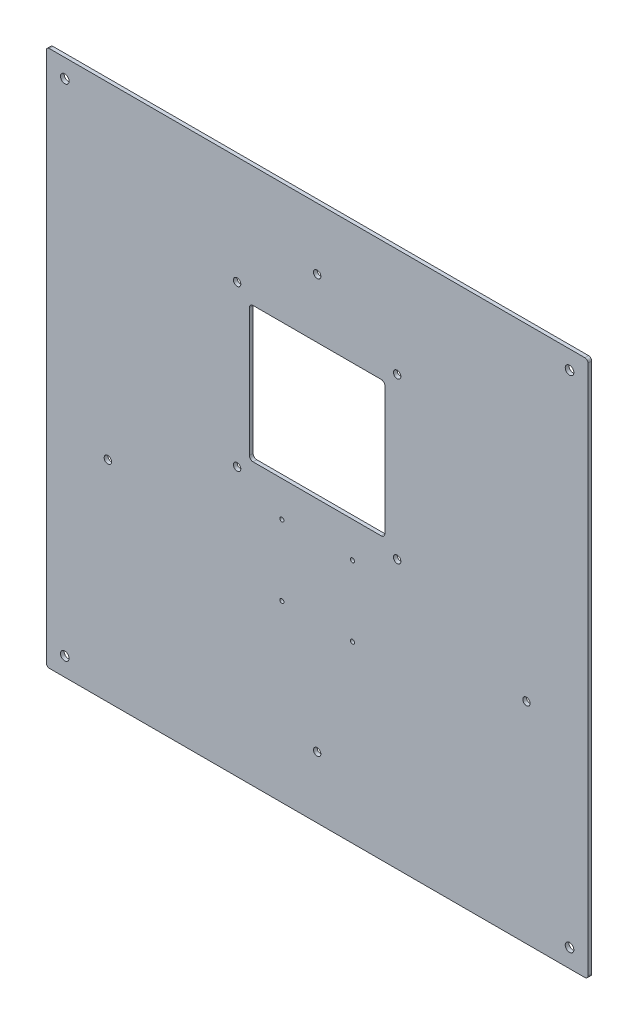
ISO-10303-21;
HEADER;
FILE_DESCRIPTION(('STEP AP214'),'2;1');
FILE_NAME('part.step','',(''),(''),'','','');
FILE_SCHEMA(('AUTOMOTIVE_DESIGN { 1 0 10303 214 1 1 1 1 }'));
ENDSEC;
DATA;
#1=APPLICATION_CONTEXT('core data for automotive mechanical design processes');
#2=APPLICATION_PROTOCOL_DEFINITION('international standard','automotive_design',2000,#1);
#3=PRODUCT_CONTEXT('',#1,'mechanical');
#4=PRODUCT('Part','Part','',(#3));
#5=PRODUCT_RELATED_PRODUCT_CATEGORY('part','',(#4));
#6=PRODUCT_DEFINITION_FORMATION('','',#4);
#7=PRODUCT_DEFINITION_CONTEXT('part definition',#1,'design');
#8=PRODUCT_DEFINITION('design','',#6,#7);
#9=PRODUCT_DEFINITION_SHAPE('','',#8);
#10=(LENGTH_UNIT() NAMED_UNIT(*) SI_UNIT(.MILLI.,.METRE.));
#11=(NAMED_UNIT(*) PLANE_ANGLE_UNIT() SI_UNIT($,.RADIAN.));
#12=(NAMED_UNIT(*) SI_UNIT($,.STERADIAN.) SOLID_ANGLE_UNIT());
#13=UNCERTAINTY_MEASURE_WITH_UNIT(LENGTH_MEASURE(1.E-05),#10,'distance_accuracy_value','');
#14=(GEOMETRIC_REPRESENTATION_CONTEXT(3) GLOBAL_UNCERTAINTY_ASSIGNED_CONTEXT((#13)) GLOBAL_UNIT_ASSIGNED_CONTEXT((#10,
#11,#12)) REPRESENTATION_CONTEXT('',''));
#15=CARTESIAN_POINT('',(0.,0.,0.));
#16=DIRECTION('',(0.,0.,1.));
#17=DIRECTION('',(1.,0.,0.));
#18=AXIS2_PLACEMENT_3D('',#15,#16,#17);
#19=CARTESIAN_POINT('',(0.,0.,3.));
#20=DIRECTION('',(0.,0.,1.));
#21=DIRECTION('',(1.,0.,0.));
#22=AXIS2_PLACEMENT_3D('',#19,#20,#21);
#23=PLANE('',#22);
#24=CARTESIAN_POINT('',(170.,-47.5,3.));
#25=DIRECTION('',(0.,0.,-1.));
#26=DIRECTION('',(-1.,0.,0.));
#27=AXIS2_PLACEMENT_3D('',#24,#25,#26);
#28=CIRCLE('',#27,3.);
#29=CARTESIAN_POINT('',(173.,-47.5,3.));
#30=VERTEX_POINT('',#29);
#31=EDGE_CURVE('E218',#30,#30,#28,.T.);
#32=ORIENTED_EDGE('',*,*,#31,.T.);
#33=EDGE_LOOP('',(#32));
#34=FACE_BOUND('',#33,.T.);
#35=CARTESIAN_POINT('',(0.,168.,3.));
#36=DIRECTION('',(0.,0.,-1.));
#37=DIRECTION('',(-1.,0.,0.));
#38=AXIS2_PLACEMENT_3D('',#35,#36,#37);
#39=CIRCLE('',#38,3.);
#40=CARTESIAN_POINT('',(3.,168.,3.));
#41=VERTEX_POINT('',#40);
#42=EDGE_CURVE('E311',#41,#41,#39,.T.);
#43=ORIENTED_EDGE('',*,*,#42,.T.);
#44=EDGE_LOOP('',(#43));
#45=FACE_BOUND('',#44,.T.);
#46=CARTESIAN_POINT('',(0.,-168.,3.));
#47=DIRECTION('',(0.,0.,-1.));
#48=DIRECTION('',(-1.,0.,0.));
#49=AXIS2_PLACEMENT_3D('',#46,#47,#48);
#50=CIRCLE('',#49,3.);
#51=CARTESIAN_POINT('',(3.,-168.,3.));
#52=VERTEX_POINT('',#51);
#53=EDGE_CURVE('E293',#52,#52,#50,.T.);
#54=ORIENTED_EDGE('',*,*,#53,.T.);
#55=EDGE_LOOP('',(#54));
#56=FACE_BOUND('',#55,.T.);
#57=CARTESIAN_POINT('',(-170.,-47.5,3.));
#58=DIRECTION('',(0.,0.,-1.));
#59=DIRECTION('',(-1.,0.,0.));
#60=AXIS2_PLACEMENT_3D('',#57,#58,#59);
#61=CIRCLE('',#60,3.);
#62=CARTESIAN_POINT('',(-167.,-47.5,3.));
#63=VERTEX_POINT('',#62);
#64=EDGE_CURVE('E353',#63,#63,#61,.T.);
#65=ORIENTED_EDGE('',*,*,#64,.T.);
#66=EDGE_LOOP('',(#65));
#67=FACE_BOUND('',#66,.T.);
#68=CARTESIAN_POINT('',(-28.638,-18.862,3.));
#69=DIRECTION('',(0.,0.,-1.));
#70=DIRECTION('',(1.,0.,0.));
#71=AXIS2_PLACEMENT_3D('',#68,#69,#70);
#72=CIRCLE('',#71,1.666);
#73=CARTESIAN_POINT('',(-30.304,-18.862,3.));
#74=VERTEX_POINT('',#73);
#75=EDGE_CURVE('E468',#74,#74,#72,.T.);
#76=ORIENTED_EDGE('',*,*,#75,.T.);
#77=EDGE_LOOP('',(#76));
#78=FACE_BOUND('',#77,.T.);
#79=CARTESIAN_POINT('',(28.638,-76.138,3.));
#80=DIRECTION('',(0.,0.,-1.));
#81=DIRECTION('',(1.,0.,0.));
#82=AXIS2_PLACEMENT_3D('',#79,#80,#81);
#83=CIRCLE('',#82,1.666);
#84=CARTESIAN_POINT('',(26.972,-76.138,3.));
#85=VERTEX_POINT('',#84);
#86=EDGE_CURVE('E285',#85,#85,#83,.T.);
#87=ORIENTED_EDGE('',*,*,#86,.T.);
#88=EDGE_LOOP('',(#87));
#89=FACE_BOUND('',#88,.T.);
#90=CARTESIAN_POINT('',(-28.638,-76.138,3.));
#91=DIRECTION('',(0.,0.,-1.));
#92=DIRECTION('',(1.,0.,0.));
#93=AXIS2_PLACEMENT_3D('',#90,#91,#92);
#94=CIRCLE('',#93,1.666);
#95=CARTESIAN_POINT('',(-30.304,-76.138,3.));
#96=VERTEX_POINT('',#95);
#97=EDGE_CURVE('E263',#96,#96,#94,.T.);
#98=ORIENTED_EDGE('',*,*,#97,.T.);
#99=EDGE_LOOP('',(#98));
#100=FACE_BOUND('',#99,.T.);
#101=CARTESIAN_POINT('',(28.638,-18.862,3.));
#102=DIRECTION('',(0.,0.,-1.));
#103=DIRECTION('',(1.,0.,0.));
#104=AXIS2_PLACEMENT_3D('',#101,#102,#103);
#105=CIRCLE('',#104,1.666);
#106=CARTESIAN_POINT('',(26.972,-18.862,3.));
#107=VERTEX_POINT('',#106);
#108=EDGE_CURVE('E494',#107,#107,#105,.T.);
#109=ORIENTED_EDGE('',*,*,#108,.T.);
#110=EDGE_LOOP('',(#109));
#111=FACE_BOUND('',#110,.T.);
#112=CARTESIAN_POINT('',(-205.,-203.,3.));
#113=DIRECTION('',(0.,0.,-1.));
#114=DIRECTION('',(-1.,0.,0.));
#115=AXIS2_PLACEMENT_3D('',#112,#113,#114);
#116=CIRCLE('',#115,3.5);
#117=CARTESIAN_POINT('',(-201.5,-203.,3.));
#118=VERTEX_POINT('',#117);
#119=EDGE_CURVE('E403',#118,#118,#116,.T.);
#120=ORIENTED_EDGE('',*,*,#119,.T.);
#121=EDGE_LOOP('',(#120));
#122=FACE_BOUND('',#121,.T.);
#123=CARTESIAN_POINT('',(-205.,203.,3.));
#124=DIRECTION('',(0.,0.,-1.));
#125=DIRECTION('',(-1.,0.,0.));
#126=AXIS2_PLACEMENT_3D('',#123,#124,#125);
#127=CIRCLE('',#126,3.5);
#128=CARTESIAN_POINT('',(-201.5,203.,3.));
#129=VERTEX_POINT('',#128);
#130=EDGE_CURVE('E299',#129,#129,#127,.T.);
#131=ORIENTED_EDGE('',*,*,#130,.T.);
#132=EDGE_LOOP('',(#131));
#133=FACE_BOUND('',#132,.T.);
#134=CARTESIAN_POINT('',(205.,-203.,3.));
#135=DIRECTION('',(0.,0.,-1.));
#136=DIRECTION('',(-1.,0.,0.));
#137=AXIS2_PLACEMENT_3D('',#134,#135,#136);
#138=CIRCLE('',#137,3.5);
#139=CARTESIAN_POINT('',(208.5,-203.,3.));
#140=VERTEX_POINT('',#139);
#141=EDGE_CURVE('E401',#140,#140,#138,.T.);
#142=ORIENTED_EDGE('',*,*,#141,.T.);
#143=EDGE_LOOP('',(#142));
#144=FACE_BOUND('',#143,.T.);
#145=CARTESIAN_POINT('',(205.,203.,3.));
#146=DIRECTION('',(0.,0.,-1.));
#147=DIRECTION('',(-1.,0.,0.));
#148=AXIS2_PLACEMENT_3D('',#145,#146,#147);
#149=CIRCLE('',#148,3.5);
#150=CARTESIAN_POINT('',(208.5,203.,3.));
#151=VERTEX_POINT('',#150);
#152=EDGE_CURVE('E402',#151,#151,#149,.T.);
#153=ORIENTED_EDGE('',*,*,#152,.T.);
#154=EDGE_LOOP('',(#153));
#155=FACE_BOUND('',#154,.T.);
#156=DIRECTION('',(0.,1.,0.));
#157=VECTOR('',#156,1.);
#158=CARTESIAN_POINT('',(-55.,6.5,3.));
#159=LINE('',#158,#157);
#160=CARTESIAN_POINT('',(-55.,13.,3.));
#161=VERTEX_POINT('',#160);
#162=CARTESIAN_POINT('',(-55.,117.,3.));
#163=VERTEX_POINT('',#162);
#164=EDGE_CURVE('E397',#161,#163,#159,.T.);
#165=ORIENTED_EDGE('',*,*,#164,.T.);
#166=CARTESIAN_POINT('',(-52.,117.,3.));
#167=DIRECTION('',(0.,0.,-1.));
#168=DIRECTION('',(0.,1.,0.));
#169=AXIS2_PLACEMENT_3D('',#166,#167,#168);
#170=CIRCLE('',#169,3.);
#171=CARTESIAN_POINT('',(-52.,120.,3.));
#172=VERTEX_POINT('',#171);
#173=EDGE_CURVE('E283',#163,#172,#170,.T.);
#174=ORIENTED_EDGE('',*,*,#173,.T.);
#175=DIRECTION('',(1.,0.,0.));
#176=VECTOR('',#175,1.);
#177=CARTESIAN_POINT('',(-26.,120.,3.));
#178=LINE('',#177,#176);
#179=CARTESIAN_POINT('',(52.,120.,3.));
#180=VERTEX_POINT('',#179);
#181=EDGE_CURVE('E257',#172,#180,#178,.T.);
#182=ORIENTED_EDGE('',*,*,#181,.T.);
#183=CARTESIAN_POINT('',(52.,117.,3.));
#184=DIRECTION('',(0.,0.,-1.));
#185=DIRECTION('',(1.,0.,0.));
#186=AXIS2_PLACEMENT_3D('',#183,#184,#185);
#187=CIRCLE('',#186,3.);
#188=CARTESIAN_POINT('',(55.,117.,3.));
#189=VERTEX_POINT('',#188);
#190=EDGE_CURVE('E258',#180,#189,#187,.T.);
#191=ORIENTED_EDGE('',*,*,#190,.T.);
#192=DIRECTION('',(0.,-1.,0.));
#193=VECTOR('',#192,1.);
#194=CARTESIAN_POINT('',(55.,58.5,3.));
#195=LINE('',#194,#193);
#196=CARTESIAN_POINT('',(55.,13.,3.));
#197=VERTEX_POINT('',#196);
#198=EDGE_CURVE('E241',#189,#197,#195,.T.);
#199=ORIENTED_EDGE('',*,*,#198,.T.);
#200=CARTESIAN_POINT('',(52.,13.,3.));
#201=DIRECTION('',(0.,0.,-1.));
#202=DIRECTION('',(0.,-1.,0.));
#203=AXIS2_PLACEMENT_3D('',#200,#201,#202);
#204=CIRCLE('',#203,3.);
#205=CARTESIAN_POINT('',(52.,10.,3.));
#206=VERTEX_POINT('',#205);
#207=EDGE_CURVE('E459',#197,#206,#204,.T.);
#208=ORIENTED_EDGE('',*,*,#207,.T.);
#209=DIRECTION('',(-1.,0.,0.));
#210=VECTOR('',#209,1.);
#211=CARTESIAN_POINT('',(26.,10.,3.));
#212=LINE('',#211,#210);
#213=CARTESIAN_POINT('',(-52.,10.,3.));
#214=VERTEX_POINT('',#213);
#215=EDGE_CURVE('E498',#206,#214,#212,.T.);
#216=ORIENTED_EDGE('',*,*,#215,.T.);
#217=CARTESIAN_POINT('',(-52.,13.,3.));
#218=DIRECTION('',(0.,0.,-1.));
#219=DIRECTION('',(-1.,0.,0.));
#220=AXIS2_PLACEMENT_3D('',#217,#218,#219);
#221=CIRCLE('',#220,3.);
#222=EDGE_CURVE('E396',#214,#161,#221,.T.);
#223=ORIENTED_EDGE('',*,*,#222,.T.);
#224=EDGE_LOOP('',(#165,#174,#182,#191,#199,#208,#216,#223));
#225=FACE_BOUND('',#224,.T.);
#226=CARTESIAN_POINT('',(65.,130.,3.));
#227=DIRECTION('',(0.,0.,-1.));
#228=DIRECTION('',(-1.,0.,0.));
#229=AXIS2_PLACEMENT_3D('',#226,#227,#228);
#230=CIRCLE('',#229,3.);
#231=CARTESIAN_POINT('',(68.,130.,3.));
#232=VERTEX_POINT('',#231);
#233=EDGE_CURVE('E251',#232,#232,#230,.T.);
#234=ORIENTED_EDGE('',*,*,#233,.T.);
#235=EDGE_LOOP('',(#234));
#236=FACE_BOUND('',#235,.T.);
#237=CARTESIAN_POINT('',(-65.,0.,3.));
#238=DIRECTION('',(0.,0.,-1.));
#239=DIRECTION('',(-1.,0.,0.));
#240=AXIS2_PLACEMENT_3D('',#237,#238,#239);
#241=CIRCLE('',#240,3.);
#242=CARTESIAN_POINT('',(-62.,0.,3.));
#243=VERTEX_POINT('',#242);
#244=EDGE_CURVE('E419',#243,#243,#241,.T.);
#245=ORIENTED_EDGE('',*,*,#244,.T.);
#246=EDGE_LOOP('',(#245));
#247=FACE_BOUND('',#246,.T.);
#248=CARTESIAN_POINT('',(65.,0.,3.));
#249=DIRECTION('',(0.,0.,-1.));
#250=DIRECTION('',(-1.,0.,0.));
#251=AXIS2_PLACEMENT_3D('',#248,#249,#250);
#252=CIRCLE('',#251,3.);
#253=CARTESIAN_POINT('',(68.,0.,3.));
#254=VERTEX_POINT('',#253);
#255=EDGE_CURVE('E384',#254,#254,#252,.T.);
#256=ORIENTED_EDGE('',*,*,#255,.T.);
#257=EDGE_LOOP('',(#256));
#258=FACE_BOUND('',#257,.T.);
#259=CARTESIAN_POINT('',(-65.,130.,3.));
#260=DIRECTION('',(0.,0.,-1.));
#261=DIRECTION('',(-1.,0.,0.));
#262=AXIS2_PLACEMENT_3D('',#259,#260,#261);
#263=CIRCLE('',#262,3.);
#264=CARTESIAN_POINT('',(-62.,130.,3.));
#265=VERTEX_POINT('',#264);
#266=EDGE_CURVE('E433',#265,#265,#263,.T.);
#267=ORIENTED_EDGE('',*,*,#266,.T.);
#268=EDGE_LOOP('',(#267));
#269=FACE_BOUND('',#268,.T.);
#270=CARTESIAN_POINT('',(217.5,215.5,3.));
#271=DIRECTION('',(0.,0.,-1.));
#272=DIRECTION('',(0.707106781186548,0.707106781186548,0.));
#273=AXIS2_PLACEMENT_3D('',#270,#271,#272);
#274=CIRCLE('',#273,2.5);
#275=CARTESIAN_POINT('',(217.5,218.,3.));
#276=VERTEX_POINT('',#275);
#277=CARTESIAN_POINT('',(220.,215.5,3.));
#278=VERTEX_POINT('',#277);
#279=EDGE_CURVE('E309',#276,#278,#274,.T.);
#280=ORIENTED_EDGE('',*,*,#279,.F.);
#281=DIRECTION('',(-1.,0.,0.));
#282=VECTOR('',#281,1.);
#283=CARTESIAN_POINT('',(-220.,218.,3.));
#284=LINE('',#283,#282);
#285=CARTESIAN_POINT('',(-217.5,218.,3.));
#286=VERTEX_POINT('',#285);
#287=EDGE_CURVE('E287',#276,#286,#284,.T.);
#288=ORIENTED_EDGE('',*,*,#287,.T.);
#289=CARTESIAN_POINT('',(-217.5,215.5,3.));
#290=DIRECTION('',(0.,0.,-1.));
#291=DIRECTION('',(-0.707106781186548,0.707106781186548,0.));
#292=AXIS2_PLACEMENT_3D('',#289,#290,#291);
#293=CIRCLE('',#292,2.5);
#294=CARTESIAN_POINT('',(-220.,215.5,3.));
#295=VERTEX_POINT('',#294);
#296=EDGE_CURVE('E225',#295,#286,#293,.T.);
#297=ORIENTED_EDGE('',*,*,#296,.F.);
#298=DIRECTION('',(0.,-1.,0.));
#299=VECTOR('',#298,1.);
#300=CARTESIAN_POINT('',(-220.,-218.,3.));
#301=LINE('',#300,#299);
#302=CARTESIAN_POINT('',(-220.,-215.5,3.));
#303=VERTEX_POINT('',#302);
#304=EDGE_CURVE('E246',#295,#303,#301,.T.);
#305=ORIENTED_EDGE('',*,*,#304,.T.);
#306=CARTESIAN_POINT('',(-217.5,-215.5,3.));
#307=DIRECTION('',(0.,0.,-1.));
#308=DIRECTION('',(-0.707106781186548,-0.707106781186548,0.));
#309=AXIS2_PLACEMENT_3D('',#306,#307,#308);
#310=CIRCLE('',#309,2.5);
#311=CARTESIAN_POINT('',(-217.5,-218.,3.));
#312=VERTEX_POINT('',#311);
#313=EDGE_CURVE('E357',#312,#303,#310,.T.);
#314=ORIENTED_EDGE('',*,*,#313,.F.);
#315=DIRECTION('',(1.,0.,0.));
#316=VECTOR('',#315,1.);
#317=CARTESIAN_POINT('',(220.,-218.,3.));
#318=LINE('',#317,#316);
#319=CARTESIAN_POINT('',(217.5,-218.,3.));
#320=VERTEX_POINT('',#319);
#321=EDGE_CURVE('E367',#312,#320,#318,.T.);
#322=ORIENTED_EDGE('',*,*,#321,.T.);
#323=CARTESIAN_POINT('',(217.5,-215.5,3.));
#324=DIRECTION('',(0.,0.,-1.));
#325=DIRECTION('',(0.707106781186548,-0.707106781186548,0.));
#326=AXIS2_PLACEMENT_3D('',#323,#324,#325);
#327=CIRCLE('',#326,2.5);
#328=CARTESIAN_POINT('',(220.,-215.5,3.));
#329=VERTEX_POINT('',#328);
#330=EDGE_CURVE('E338',#329,#320,#327,.T.);
#331=ORIENTED_EDGE('',*,*,#330,.F.);
#332=DIRECTION('',(0.,1.,0.));
#333=VECTOR('',#332,1.);
#334=CARTESIAN_POINT('',(220.,218.,3.));
#335=LINE('',#334,#333);
#336=EDGE_CURVE('E10',#329,#278,#335,.T.);
#337=ORIENTED_EDGE('',*,*,#336,.T.);
#338=EDGE_LOOP('',(#280,#288,#297,#305,#314,#322,#331,#337));
#339=FACE_BOUND('',#338,.T.);
#340=ADVANCED_FACE('F15',(#34,#45,#56,#67,#78,#89,#100,#111,#122,#133,#144,#155,#225,#236,#247,
#258,#269,#339),#23,.T.);
#341=CARTESIAN_POINT('',(220.,-218.,0.));
#342=DIRECTION('',(1.,0.,0.));
#343=DIRECTION('',(0.,1.,0.));
#344=AXIS2_PLACEMENT_3D('',#341,#342,#343);
#345=PLANE('',#344);
#346=DIRECTION('',(0.,0.,-1.));
#347=VECTOR('',#346,1.);
#348=CARTESIAN_POINT('',(220.,215.5,0.));
#349=LINE('',#348,#347);
#350=CARTESIAN_POINT('',(220.,215.5,0.));
#351=VERTEX_POINT('',#350);
#352=EDGE_CURVE('E305',#278,#351,#349,.T.);
#353=ORIENTED_EDGE('',*,*,#352,.F.);
#354=ORIENTED_EDGE('',*,*,#336,.F.);
#355=DIRECTION('',(0.,0.,1.));
#356=VECTOR('',#355,1.);
#357=CARTESIAN_POINT('',(220.,-215.5,0.));
#358=LINE('',#357,#356);
#359=CARTESIAN_POINT('',(220.,-215.5,0.));
#360=VERTEX_POINT('',#359);
#361=EDGE_CURVE('E333',#360,#329,#358,.T.);
#362=ORIENTED_EDGE('',*,*,#361,.F.);
#363=DIRECTION('',(0.,-1.,0.));
#364=VECTOR('',#363,1.);
#365=CARTESIAN_POINT('',(220.,218.,0.));
#366=LINE('',#365,#364);
#367=EDGE_CURVE('E291',#351,#360,#366,.T.);
#368=ORIENTED_EDGE('',*,*,#367,.F.);
#369=EDGE_LOOP('',(#353,#354,#362,#368));
#370=FACE_BOUND('',#369,.T.);
#371=ADVANCED_FACE('F591',(#370),#345,.T.);
#372=CARTESIAN_POINT('',(170.,-47.5,3.));
#373=DIRECTION('',(0.,0.,-1.));
#374=DIRECTION('',(-1.,0.,0.));
#375=AXIS2_PLACEMENT_3D('',#372,#373,#374);
#376=CYLINDRICAL_SURFACE('',#375,3.);
#377=ORIENTED_EDGE('',*,*,#31,.F.);
#378=DIRECTION('',(0.,0.,-1.));
#379=VECTOR('',#378,1.);
#380=CARTESIAN_POINT('',(173.,-47.5,3.));
#381=LINE('',#380,#379);
#382=CARTESIAN_POINT('',(173.,-47.5,0.));
#383=VERTEX_POINT('',#382);
#384=EDGE_CURVE('E26',#30,#383,#381,.T.);
#385=ORIENTED_EDGE('',*,*,#384,.T.);
#386=CARTESIAN_POINT('',(170.,-47.5,0.));
#387=DIRECTION('',(0.,0.,1.));
#388=DIRECTION('',(-1.,0.,0.));
#389=AXIS2_PLACEMENT_3D('',#386,#387,#388);
#390=CIRCLE('',#389,3.);
#391=EDGE_CURVE('E217',#383,#383,#390,.T.);
#392=ORIENTED_EDGE('',*,*,#391,.F.);
#393=ORIENTED_EDGE('',*,*,#384,.F.);
#394=EDGE_LOOP('',(#377,#385,#392,#393));
#395=FACE_BOUND('',#394,.T.);
#396=ADVANCED_FACE('F216',(#395),#376,.F.);
#397=CARTESIAN_POINT('',(0.,168.,3.));
#398=DIRECTION('',(0.,0.,-1.));
#399=DIRECTION('',(-1.,0.,0.));
#400=AXIS2_PLACEMENT_3D('',#397,#398,#399);
#401=CYLINDRICAL_SURFACE('',#400,3.);
#402=ORIENTED_EDGE('',*,*,#42,.F.);
#403=DIRECTION('',(0.,0.,-1.));
#404=VECTOR('',#403,1.);
#405=CARTESIAN_POINT('',(3.,168.,3.));
#406=LINE('',#405,#404);
#407=CARTESIAN_POINT('',(3.,168.,0.));
#408=VERTEX_POINT('',#407);
#409=EDGE_CURVE('E321',#41,#408,#406,.T.);
#410=ORIENTED_EDGE('',*,*,#409,.T.);
#411=CARTESIAN_POINT('',(0.,168.,0.));
#412=DIRECTION('',(0.,0.,1.));
#413=DIRECTION('',(-1.,0.,0.));
#414=AXIS2_PLACEMENT_3D('',#411,#412,#413);
#415=CIRCLE('',#414,3.);
#416=EDGE_CURVE('E226',#408,#408,#415,.T.);
#417=ORIENTED_EDGE('',*,*,#416,.F.);
#418=ORIENTED_EDGE('',*,*,#409,.F.);
#419=EDGE_LOOP('',(#402,#410,#417,#418));
#420=FACE_BOUND('',#419,.T.);
#421=ADVANCED_FACE('F822',(#420),#401,.F.);
#422=CARTESIAN_POINT('',(0.,-168.,3.));
#423=DIRECTION('',(0.,0.,-1.));
#424=DIRECTION('',(-1.,0.,0.));
#425=AXIS2_PLACEMENT_3D('',#422,#423,#424);
#426=CYLINDRICAL_SURFACE('',#425,3.);
#427=ORIENTED_EDGE('',*,*,#53,.F.);
#428=DIRECTION('',(0.,0.,-1.));
#429=VECTOR('',#428,1.);
#430=CARTESIAN_POINT('',(3.,-168.,3.));
#431=LINE('',#430,#429);
#432=CARTESIAN_POINT('',(3.,-168.,0.));
#433=VERTEX_POINT('',#432);
#434=EDGE_CURVE('E297',#52,#433,#431,.T.);
#435=ORIENTED_EDGE('',*,*,#434,.T.);
#436=CARTESIAN_POINT('',(0.,-168.,0.));
#437=DIRECTION('',(0.,0.,1.));
#438=DIRECTION('',(-1.,0.,0.));
#439=AXIS2_PLACEMENT_3D('',#436,#437,#438);
#440=CIRCLE('',#439,3.);
#441=EDGE_CURVE('E237',#433,#433,#440,.T.);
#442=ORIENTED_EDGE('',*,*,#441,.F.);
#443=ORIENTED_EDGE('',*,*,#434,.F.);
#444=EDGE_LOOP('',(#427,#435,#442,#443));
#445=FACE_BOUND('',#444,.T.);
#446=ADVANCED_FACE('F825',(#445),#426,.F.);
#447=CARTESIAN_POINT('',(-170.,-47.5,3.));
#448=DIRECTION('',(0.,0.,-1.));
#449=DIRECTION('',(-1.,0.,0.));
#450=AXIS2_PLACEMENT_3D('',#447,#448,#449);
#451=CYLINDRICAL_SURFACE('',#450,3.);
#452=ORIENTED_EDGE('',*,*,#64,.F.);
#453=DIRECTION('',(0.,0.,-1.));
#454=VECTOR('',#453,1.);
#455=CARTESIAN_POINT('',(-167.,-47.5,3.));
#456=LINE('',#455,#454);
#457=CARTESIAN_POINT('',(-167.,-47.5,0.));
#458=VERTEX_POINT('',#457);
#459=EDGE_CURVE('E298',#63,#458,#456,.T.);
#460=ORIENTED_EDGE('',*,*,#459,.T.);
#461=CARTESIAN_POINT('',(-170.,-47.5,0.));
#462=DIRECTION('',(0.,0.,1.));
#463=DIRECTION('',(-1.,0.,0.));
#464=AXIS2_PLACEMENT_3D('',#461,#462,#463);
#465=CIRCLE('',#464,3.);
#466=EDGE_CURVE('E546',#458,#458,#465,.T.);
#467=ORIENTED_EDGE('',*,*,#466,.F.);
#468=ORIENTED_EDGE('',*,*,#459,.F.);
#469=EDGE_LOOP('',(#452,#460,#467,#468));
#470=FACE_BOUND('',#469,.T.);
#471=ADVANCED_FACE('F834',(#470),#451,.F.);
#472=CARTESIAN_POINT('',(-28.638,-18.862,1.5));
#473=DIRECTION('',(0.,0.,-1.));
#474=DIRECTION('',(1.,0.,0.));
#475=AXIS2_PLACEMENT_3D('',#472,#473,#474);
#476=CYLINDRICAL_SURFACE('',#475,1.666);
#477=ORIENTED_EDGE('',*,*,#75,.F.);
#478=DIRECTION('',(0.,0.,-1.));
#479=VECTOR('',#478,1.);
#480=CARTESIAN_POINT('',(-30.304,-18.862,1.5));
#481=LINE('',#480,#479);
#482=CARTESIAN_POINT('',(-30.304,-18.862,0.));
#483=VERTEX_POINT('',#482);
#484=EDGE_CURVE('E443',#74,#483,#481,.T.);
#485=ORIENTED_EDGE('',*,*,#484,.T.);
#486=CARTESIAN_POINT('',(-28.638,-18.862,0.));
#487=DIRECTION('',(0.,0.,1.));
#488=DIRECTION('',(1.,0.,0.));
#489=AXIS2_PLACEMENT_3D('',#486,#487,#488);
#490=CIRCLE('',#489,1.666);
#491=EDGE_CURVE('E343',#483,#483,#490,.T.);
#492=ORIENTED_EDGE('',*,*,#491,.F.);
#493=ORIENTED_EDGE('',*,*,#484,.F.);
#494=EDGE_LOOP('',(#477,#485,#492,#493));
#495=FACE_BOUND('',#494,.T.);
#496=ADVANCED_FACE('F796',(#495),#476,.F.);
#497=CARTESIAN_POINT('',(28.638,-76.138,1.5));
#498=DIRECTION('',(0.,0.,-1.));
#499=DIRECTION('',(1.,0.,0.));
#500=AXIS2_PLACEMENT_3D('',#497,#498,#499);
#501=CYLINDRICAL_SURFACE('',#500,1.666);
#502=ORIENTED_EDGE('',*,*,#86,.F.);
#503=DIRECTION('',(0.,0.,-1.));
#504=VECTOR('',#503,1.);
#505=CARTESIAN_POINT('',(26.972,-76.138,1.5));
#506=LINE('',#505,#504);
#507=CARTESIAN_POINT('',(26.972,-76.138,0.));
#508=VERTEX_POINT('',#507);
#509=EDGE_CURVE('E414',#85,#508,#506,.T.);
#510=ORIENTED_EDGE('',*,*,#509,.T.);
#511=CARTESIAN_POINT('',(28.638,-76.138,0.));
#512=DIRECTION('',(0.,0.,1.));
#513=DIRECTION('',(1.,0.,0.));
#514=AXIS2_PLACEMENT_3D('',#511,#512,#513);
#515=CIRCLE('',#514,1.666);
#516=EDGE_CURVE('E339',#508,#508,#515,.T.);
#517=ORIENTED_EDGE('',*,*,#516,.F.);
#518=ORIENTED_EDGE('',*,*,#509,.F.);
#519=EDGE_LOOP('',(#502,#510,#517,#518));
#520=FACE_BOUND('',#519,.T.);
#521=ADVANCED_FACE('F831',(#520),#501,.F.);
#522=CARTESIAN_POINT('',(-28.638,-76.138,1.5));
#523=DIRECTION('',(0.,0.,-1.));
#524=DIRECTION('',(1.,0.,0.));
#525=AXIS2_PLACEMENT_3D('',#522,#523,#524);
#526=CYLINDRICAL_SURFACE('',#525,1.666);
#527=ORIENTED_EDGE('',*,*,#97,.F.);
#528=DIRECTION('',(0.,0.,-1.));
#529=VECTOR('',#528,1.);
#530=CARTESIAN_POINT('',(-30.304,-76.138,1.5));
#531=LINE('',#530,#529);
#532=CARTESIAN_POINT('',(-30.304,-76.138,0.));
#533=VERTEX_POINT('',#532);
#534=EDGE_CURVE('E267',#96,#533,#531,.T.);
#535=ORIENTED_EDGE('',*,*,#534,.T.);
#536=CARTESIAN_POINT('',(-28.638,-76.138,0.));
#537=DIRECTION('',(0.,0.,1.));
#538=DIRECTION('',(1.,0.,0.));
#539=AXIS2_PLACEMENT_3D('',#536,#537,#538);
#540=CIRCLE('',#539,1.666);
#541=EDGE_CURVE('E344',#533,#533,#540,.T.);
#542=ORIENTED_EDGE('',*,*,#541,.F.);
#543=ORIENTED_EDGE('',*,*,#534,.F.);
#544=EDGE_LOOP('',(#527,#535,#542,#543));
#545=FACE_BOUND('',#544,.T.);
#546=ADVANCED_FACE('F765',(#545),#526,.F.);
#547=CARTESIAN_POINT('',(28.638,-18.862,1.5));
#548=DIRECTION('',(0.,0.,-1.));
#549=DIRECTION('',(1.,0.,0.));
#550=AXIS2_PLACEMENT_3D('',#547,#548,#549);
#551=CYLINDRICAL_SURFACE('',#550,1.666);
#552=ORIENTED_EDGE('',*,*,#108,.F.);
#553=DIRECTION('',(0.,0.,-1.));
#554=VECTOR('',#553,1.);
#555=CARTESIAN_POINT('',(26.972,-18.862,1.5));
#556=LINE('',#555,#554);
#557=CARTESIAN_POINT('',(26.972,-18.862,0.));
#558=VERTEX_POINT('',#557);
#559=EDGE_CURVE('E268',#107,#558,#556,.T.);
#560=ORIENTED_EDGE('',*,*,#559,.T.);
#561=CARTESIAN_POINT('',(28.638,-18.862,0.));
#562=DIRECTION('',(0.,0.,1.));
#563=DIRECTION('',(1.,0.,0.));
#564=AXIS2_PLACEMENT_3D('',#561,#562,#563);
#565=CIRCLE('',#564,1.666);
#566=EDGE_CURVE('E427',#558,#558,#565,.T.);
#567=ORIENTED_EDGE('',*,*,#566,.F.);
#568=ORIENTED_EDGE('',*,*,#559,.F.);
#569=EDGE_LOOP('',(#552,#560,#567,#568));
#570=FACE_BOUND('',#569,.T.);
#571=ADVANCED_FACE('F756',(#570),#551,.F.);
#572=CARTESIAN_POINT('',(-205.,-203.,3.));
#573=DIRECTION('',(0.,0.,-1.));
#574=DIRECTION('',(-1.,0.,0.));
#575=AXIS2_PLACEMENT_3D('',#572,#573,#574);
#576=CYLINDRICAL_SURFACE('',#575,3.5);
#577=ORIENTED_EDGE('',*,*,#119,.F.);
#578=DIRECTION('',(0.,0.,-1.));
#579=VECTOR('',#578,1.);
#580=CARTESIAN_POINT('',(-201.5,-203.,3.));
#581=LINE('',#580,#579);
#582=CARTESIAN_POINT('',(-201.5,-203.,0.));
#583=VERTEX_POINT('',#582);
#584=EDGE_CURVE('E406',#118,#583,#581,.T.);
#585=ORIENTED_EDGE('',*,*,#584,.T.);
#586=CARTESIAN_POINT('',(-205.,-203.,0.));
#587=DIRECTION('',(0.,0.,1.));
#588=DIRECTION('',(-1.,0.,0.));
#589=AXIS2_PLACEMENT_3D('',#586,#587,#588);
#590=CIRCLE('',#589,3.5);
#591=EDGE_CURVE('E428',#583,#583,#590,.T.);
#592=ORIENTED_EDGE('',*,*,#591,.F.);
#593=ORIENTED_EDGE('',*,*,#584,.F.);
#594=EDGE_LOOP('',(#577,#585,#592,#593));
#595=FACE_BOUND('',#594,.T.);
#596=ADVANCED_FACE('F753',(#595),#576,.F.);
#597=CARTESIAN_POINT('',(-205.,203.,3.));
#598=DIRECTION('',(0.,0.,-1.));
#599=DIRECTION('',(-1.,0.,0.));
#600=AXIS2_PLACEMENT_3D('',#597,#598,#599);
#601=CYLINDRICAL_SURFACE('',#600,3.5);
#602=ORIENTED_EDGE('',*,*,#130,.F.);
#603=DIRECTION('',(0.,0.,-1.));
#604=VECTOR('',#603,1.);
#605=CARTESIAN_POINT('',(-201.5,203.,3.));
#606=LINE('',#605,#604);
#607=CARTESIAN_POINT('',(-201.5,203.,0.));
#608=VERTEX_POINT('',#607);
#609=EDGE_CURVE('E303',#129,#608,#606,.T.);
#610=ORIENTED_EDGE('',*,*,#609,.T.);
#611=CARTESIAN_POINT('',(-205.,203.,0.));
#612=DIRECTION('',(0.,0.,1.));
#613=DIRECTION('',(-1.,0.,0.));
#614=AXIS2_PLACEMENT_3D('',#611,#612,#613);
#615=CIRCLE('',#614,3.5);
#616=EDGE_CURVE('E432',#608,#608,#615,.T.);
#617=ORIENTED_EDGE('',*,*,#616,.F.);
#618=ORIENTED_EDGE('',*,*,#609,.F.);
#619=EDGE_LOOP('',(#602,#610,#617,#618));
#620=FACE_BOUND('',#619,.T.);
#621=ADVANCED_FACE('F755',(#620),#601,.F.);
#622=CARTESIAN_POINT('',(205.,-203.,3.));
#623=DIRECTION('',(0.,0.,-1.));
#624=DIRECTION('',(-1.,0.,0.));
#625=AXIS2_PLACEMENT_3D('',#622,#623,#624);
#626=CYLINDRICAL_SURFACE('',#625,3.5);
#627=ORIENTED_EDGE('',*,*,#141,.F.);
#628=DIRECTION('',(0.,0.,-1.));
#629=VECTOR('',#628,1.);
#630=CARTESIAN_POINT('',(208.5,-203.,3.));
#631=LINE('',#630,#629);
#632=CARTESIAN_POINT('',(208.5,-203.,0.));
#633=VERTEX_POINT('',#632);
#634=EDGE_CURVE('E304',#140,#633,#631,.T.);
#635=ORIENTED_EDGE('',*,*,#634,.T.);
#636=CARTESIAN_POINT('',(205.,-203.,0.));
#637=DIRECTION('',(0.,0.,1.));
#638=DIRECTION('',(-1.,0.,0.));
#639=AXIS2_PLACEMENT_3D('',#636,#637,#638);
#640=CIRCLE('',#639,3.5);
#641=EDGE_CURVE('E19',#633,#633,#640,.T.);
#642=ORIENTED_EDGE('',*,*,#641,.F.);
#643=ORIENTED_EDGE('',*,*,#634,.F.);
#644=EDGE_LOOP('',(#627,#635,#642,#643));
#645=FACE_BOUND('',#644,.T.);
#646=ADVANCED_FACE('F762',(#645),#626,.F.);
#647=CARTESIAN_POINT('',(205.,203.,3.));
#648=DIRECTION('',(0.,0.,-1.));
#649=DIRECTION('',(-1.,0.,0.));
#650=AXIS2_PLACEMENT_3D('',#647,#648,#649);
#651=CYLINDRICAL_SURFACE('',#650,3.5);
#652=ORIENTED_EDGE('',*,*,#152,.F.);
#653=DIRECTION('',(0.,0.,-1.));
#654=VECTOR('',#653,1.);
#655=CARTESIAN_POINT('',(208.5,203.,3.));
#656=LINE('',#655,#654);
#657=CARTESIAN_POINT('',(208.5,203.,0.));
#658=VERTEX_POINT('',#657);
#659=EDGE_CURVE('E398',#151,#658,#656,.T.);
#660=ORIENTED_EDGE('',*,*,#659,.T.);
#661=CARTESIAN_POINT('',(205.,203.,0.));
#662=DIRECTION('',(0.,0.,1.));
#663=DIRECTION('',(-1.,0.,0.));
#664=AXIS2_PLACEMENT_3D('',#661,#662,#663);
#665=CIRCLE('',#664,3.5);
#666=EDGE_CURVE('E454',#658,#658,#665,.T.);
#667=ORIENTED_EDGE('',*,*,#666,.F.);
#668=ORIENTED_EDGE('',*,*,#659,.F.);
#669=EDGE_LOOP('',(#652,#660,#667,#668));
#670=FACE_BOUND('',#669,.T.);
#671=ADVANCED_FACE('F777',(#670),#651,.F.);
#672=CARTESIAN_POINT('',(52.,13.,3.));
#673=DIRECTION('',(0.,0.,-1.));
#674=DIRECTION('',(0.,-1.,0.));
#675=AXIS2_PLACEMENT_3D('',#672,#673,#674);
#676=CYLINDRICAL_SURFACE('',#675,3.);
#677=CARTESIAN_POINT('',(52.,13.,0.));
#678=DIRECTION('',(0.,0.,1.));
#679=DIRECTION('',(0.,-1.,0.));
#680=AXIS2_PLACEMENT_3D('',#677,#678,#679);
#681=CIRCLE('',#680,3.);
#682=CARTESIAN_POINT('',(52.,10.,0.));
#683=VERTEX_POINT('',#682);
#684=CARTESIAN_POINT('',(55.,13.,0.));
#685=VERTEX_POINT('',#684);
#686=EDGE_CURVE('E418',#683,#685,#681,.T.);
#687=ORIENTED_EDGE('',*,*,#686,.F.);
#688=DIRECTION('',(0.,0.,-1.));
#689=VECTOR('',#688,1.);
#690=CARTESIAN_POINT('',(52.,10.,3.));
#691=LINE('',#690,#689);
#692=EDGE_CURVE('E331',#206,#683,#691,.T.);
#693=ORIENTED_EDGE('',*,*,#692,.F.);
#694=ORIENTED_EDGE('',*,*,#207,.F.);
#695=DIRECTION('',(0.,0.,-1.));
#696=VECTOR('',#695,1.);
#697=CARTESIAN_POINT('',(55.,13.,3.));
#698=LINE('',#697,#696);
#699=EDGE_CURVE('E337',#197,#685,#698,.T.);
#700=ORIENTED_EDGE('',*,*,#699,.T.);
#701=EDGE_LOOP('',(#687,#693,#694,#700));
#702=FACE_BOUND('',#701,.T.);
#703=ADVANCED_FACE('F694',(#702),#676,.F.);
#704=CARTESIAN_POINT('',(52.,10.,3.));
#705=DIRECTION('',(0.,-1.,0.));
#706=DIRECTION('',(0.,0.,-1.));
#707=AXIS2_PLACEMENT_3D('',#704,#705,#706);
#708=PLANE('',#707);
#709=DIRECTION('',(1.,0.,0.));
#710=VECTOR('',#709,1.);
#711=CARTESIAN_POINT('',(26.,10.,0.));
#712=LINE('',#711,#710);
#713=CARTESIAN_POINT('',(-52.,10.,0.));
#714=VERTEX_POINT('',#713);
#715=EDGE_CURVE('E278',#714,#683,#712,.T.);
#716=ORIENTED_EDGE('',*,*,#715,.F.);
#717=DIRECTION('',(0.,0.,-1.));
#718=VECTOR('',#717,1.);
#719=CARTESIAN_POINT('',(-52.,10.,3.));
#720=LINE('',#719,#718);
#721=EDGE_CURVE('E184',#214,#714,#720,.T.);
#722=ORIENTED_EDGE('',*,*,#721,.F.);
#723=ORIENTED_EDGE('',*,*,#215,.F.);
#724=ORIENTED_EDGE('',*,*,#692,.T.);
#725=EDGE_LOOP('',(#716,#722,#723,#724));
#726=FACE_BOUND('',#725,.T.);
#727=ADVANCED_FACE('F698',(#726),#708,.F.);
#728=CARTESIAN_POINT('',(-52.,13.,3.));
#729=DIRECTION('',(0.,0.,-1.));
#730=DIRECTION('',(-1.,0.,0.));
#731=AXIS2_PLACEMENT_3D('',#728,#729,#730);
#732=CYLINDRICAL_SURFACE('',#731,3.);
#733=CARTESIAN_POINT('',(-52.,13.,0.));
#734=DIRECTION('',(0.,0.,1.));
#735=DIRECTION('',(-1.,0.,0.));
#736=AXIS2_PLACEMENT_3D('',#733,#734,#735);
#737=CIRCLE('',#736,3.);
#738=CARTESIAN_POINT('',(-55.,13.,0.));
#739=VERTEX_POINT('',#738);
#740=EDGE_CURVE('E274',#739,#714,#737,.T.);
#741=ORIENTED_EDGE('',*,*,#740,.F.);
#742=DIRECTION('',(0.,0.,-1.));
#743=VECTOR('',#742,1.);
#744=CARTESIAN_POINT('',(-55.,13.,3.));
#745=LINE('',#744,#743);
#746=EDGE_CURVE('E173',#161,#739,#745,.T.);
#747=ORIENTED_EDGE('',*,*,#746,.F.);
#748=ORIENTED_EDGE('',*,*,#222,.F.);
#749=ORIENTED_EDGE('',*,*,#721,.T.);
#750=EDGE_LOOP('',(#741,#747,#748,#749));
#751=FACE_BOUND('',#750,.T.);
#752=ADVANCED_FACE('F699',(#751),#732,.F.);
#753=CARTESIAN_POINT('',(-55.,13.,3.));
#754=DIRECTION('',(-1.,0.,0.));
#755=DIRECTION('',(0.,0.,1.));
#756=AXIS2_PLACEMENT_3D('',#753,#754,#755);
#757=PLANE('',#756);
#758=DIRECTION('',(0.,-1.,0.));
#759=VECTOR('',#758,1.);
#760=CARTESIAN_POINT('',(-55.,6.5,0.));
#761=LINE('',#760,#759);
#762=CARTESIAN_POINT('',(-55.,117.,0.));
#763=VERTEX_POINT('',#762);
#764=EDGE_CURVE('E279',#763,#739,#761,.T.);
#765=ORIENTED_EDGE('',*,*,#764,.F.);
#766=DIRECTION('',(0.,0.,-1.));
#767=VECTOR('',#766,1.);
#768=CARTESIAN_POINT('',(-55.,117.,3.));
#769=LINE('',#768,#767);
#770=EDGE_CURVE('E449',#163,#763,#769,.T.);
#771=ORIENTED_EDGE('',*,*,#770,.F.);
#772=ORIENTED_EDGE('',*,*,#164,.F.);
#773=ORIENTED_EDGE('',*,*,#746,.T.);
#774=EDGE_LOOP('',(#765,#771,#772,#773));
#775=FACE_BOUND('',#774,.T.);
#776=ADVANCED_FACE('F700',(#775),#757,.F.);
#777=CARTESIAN_POINT('',(-52.,117.,3.));
#778=DIRECTION('',(0.,0.,-1.));
#779=DIRECTION('',(0.,1.,0.));
#780=AXIS2_PLACEMENT_3D('',#777,#778,#779);
#781=CYLINDRICAL_SURFACE('',#780,3.);
#782=CARTESIAN_POINT('',(-52.,117.,0.));
#783=DIRECTION('',(0.,0.,1.));
#784=DIRECTION('',(0.,1.,0.));
#785=AXIS2_PLACEMENT_3D('',#782,#783,#784);
#786=CIRCLE('',#785,3.);
#787=CARTESIAN_POINT('',(-52.,120.,0.));
#788=VERTEX_POINT('',#787);
#789=EDGE_CURVE('E450',#788,#763,#786,.T.);
#790=ORIENTED_EDGE('',*,*,#789,.F.);
#791=DIRECTION('',(0.,0.,-1.));
#792=VECTOR('',#791,1.);
#793=CARTESIAN_POINT('',(-52.,120.,3.));
#794=LINE('',#793,#792);
#795=EDGE_CURVE('E262',#172,#788,#794,.T.);
#796=ORIENTED_EDGE('',*,*,#795,.F.);
#797=ORIENTED_EDGE('',*,*,#173,.F.);
#798=ORIENTED_EDGE('',*,*,#770,.T.);
#799=EDGE_LOOP('',(#790,#796,#797,#798));
#800=FACE_BOUND('',#799,.T.);
#801=ADVANCED_FACE('F681',(#800),#781,.F.);
#802=CARTESIAN_POINT('',(-52.,120.,3.));
#803=DIRECTION('',(0.,1.,0.));
#804=DIRECTION('',(1.,0.,0.));
#805=AXIS2_PLACEMENT_3D('',#802,#803,#804);
#806=PLANE('',#805);
#807=DIRECTION('',(-1.,0.,0.));
#808=VECTOR('',#807,1.);
#809=CARTESIAN_POINT('',(-26.,120.,0.));
#810=LINE('',#809,#808);
#811=CARTESIAN_POINT('',(52.,120.,0.));
#812=VERTEX_POINT('',#811);
#813=EDGE_CURVE('E455',#812,#788,#810,.T.);
#814=ORIENTED_EDGE('',*,*,#813,.F.);
#815=DIRECTION('',(0.,0.,-1.));
#816=VECTOR('',#815,1.);
#817=CARTESIAN_POINT('',(52.,120.,3.));
#818=LINE('',#817,#816);
#819=EDGE_CURVE('E253',#180,#812,#818,.T.);
#820=ORIENTED_EDGE('',*,*,#819,.F.);
#821=ORIENTED_EDGE('',*,*,#181,.F.);
#822=ORIENTED_EDGE('',*,*,#795,.T.);
#823=EDGE_LOOP('',(#814,#820,#821,#822));
#824=FACE_BOUND('',#823,.T.);
#825=ADVANCED_FACE('F684',(#824),#806,.F.);
#826=CARTESIAN_POINT('',(52.,117.,3.));
#827=DIRECTION('',(0.,0.,-1.));
#828=DIRECTION('',(1.,0.,0.));
#829=AXIS2_PLACEMENT_3D('',#826,#827,#828);
#830=CYLINDRICAL_SURFACE('',#829,3.);
#831=CARTESIAN_POINT('',(52.,117.,0.));
#832=DIRECTION('',(0.,0.,1.));
#833=DIRECTION('',(1.,0.,0.));
#834=AXIS2_PLACEMENT_3D('',#831,#832,#833);
#835=CIRCLE('',#834,3.);
#836=CARTESIAN_POINT('',(55.,117.,0.));
#837=VERTEX_POINT('',#836);
#838=EDGE_CURVE('E479',#837,#812,#835,.T.);
#839=ORIENTED_EDGE('',*,*,#838,.F.);
#840=DIRECTION('',(0.,0.,-1.));
#841=VECTOR('',#840,1.);
#842=CARTESIAN_POINT('',(55.,117.,3.));
#843=LINE('',#842,#841);
#844=EDGE_CURVE('E462',#189,#837,#843,.T.);
#845=ORIENTED_EDGE('',*,*,#844,.F.);
#846=ORIENTED_EDGE('',*,*,#190,.F.);
#847=ORIENTED_EDGE('',*,*,#819,.T.);
#848=EDGE_LOOP('',(#839,#845,#846,#847));
#849=FACE_BOUND('',#848,.T.);
#850=ADVANCED_FACE('F687',(#849),#830,.F.);
#851=CARTESIAN_POINT('',(55.,117.,3.));
#852=DIRECTION('',(1.,0.,0.));
#853=DIRECTION('',(0.,-1.,0.));
#854=AXIS2_PLACEMENT_3D('',#851,#852,#853);
#855=PLANE('',#854);
#856=DIRECTION('',(0.,1.,0.));
#857=VECTOR('',#856,1.);
#858=CARTESIAN_POINT('',(55.,58.5,0.));
#859=LINE('',#858,#857);
#860=EDGE_CURVE('E475',#685,#837,#859,.T.);
#861=ORIENTED_EDGE('',*,*,#860,.F.);
#862=ORIENTED_EDGE('',*,*,#699,.F.);
#863=ORIENTED_EDGE('',*,*,#198,.F.);
#864=ORIENTED_EDGE('',*,*,#844,.T.);
#865=EDGE_LOOP('',(#861,#862,#863,#864));
#866=FACE_BOUND('',#865,.T.);
#867=ADVANCED_FACE('F691',(#866),#855,.F.);
#868=CARTESIAN_POINT('',(217.5,-215.5,0.));
#869=DIRECTION('',(0.,0.,1.));
#870=DIRECTION('',(0.707106781186548,-0.707106781186548,0.));
#871=AXIS2_PLACEMENT_3D('',#868,#869,#870);
#872=CYLINDRICAL_SURFACE('',#871,2.5);
#873=ORIENTED_EDGE('',*,*,#330,.T.);
#874=DIRECTION('',(0.,0.,-1.));
#875=VECTOR('',#874,1.);
#876=CARTESIAN_POINT('',(217.5,-218.,0.));
#877=LINE('',#876,#875);
#878=CARTESIAN_POINT('',(217.5,-218.,0.));
#879=VERTEX_POINT('',#878);
#880=EDGE_CURVE('E374',#320,#879,#877,.T.);
#881=ORIENTED_EDGE('',*,*,#880,.T.);
#882=CARTESIAN_POINT('',(217.5,-215.5,0.));
#883=DIRECTION('',(0.,0.,1.));
#884=DIRECTION('',(0.707106781186548,-0.707106781186548,0.));
#885=AXIS2_PLACEMENT_3D('',#882,#883,#884);
#886=CIRCLE('',#885,2.5);
#887=EDGE_CURVE('E378',#879,#360,#886,.T.);
#888=ORIENTED_EDGE('',*,*,#887,.T.);
#889=ORIENTED_EDGE('',*,*,#361,.T.);
#890=EDGE_LOOP('',(#873,#881,#888,#889));
#891=FACE_BOUND('',#890,.T.);
#892=ADVANCED_FACE('F722',(#891),#872,.T.);
#893=CARTESIAN_POINT('',(-220.,-218.,0.));
#894=DIRECTION('',(0.,-1.,0.));
#895=DIRECTION('',(0.,0.,-1.));
#896=AXIS2_PLACEMENT_3D('',#893,#894,#895);
#897=PLANE('',#896);
#898=DIRECTION('',(0.,0.,1.));
#899=VECTOR('',#898,1.);
#900=CARTESIAN_POINT('',(-217.5,-218.,0.));
#901=LINE('',#900,#899);
#902=CARTESIAN_POINT('',(-217.5,-218.,0.));
#903=VERTEX_POINT('',#902);
#904=EDGE_CURVE('E550',#903,#312,#901,.T.);
#905=ORIENTED_EDGE('',*,*,#904,.F.);
#906=DIRECTION('',(-1.,0.,0.));
#907=VECTOR('',#906,1.);
#908=CARTESIAN_POINT('',(220.,-218.,0.));
#909=LINE('',#908,#907);
#910=EDGE_CURVE('E508',#879,#903,#909,.T.);
#911=ORIENTED_EDGE('',*,*,#910,.F.);
#912=ORIENTED_EDGE('',*,*,#880,.F.);
#913=ORIENTED_EDGE('',*,*,#321,.F.);
#914=EDGE_LOOP('',(#905,#911,#912,#913));
#915=FACE_BOUND('',#914,.T.);
#916=ADVANCED_FACE('F719',(#915),#897,.T.);
#917=CARTESIAN_POINT('',(-217.5,-215.5,0.));
#918=DIRECTION('',(0.,0.,1.));
#919=DIRECTION('',(-0.707106781186548,-0.707106781186548,0.));
#920=AXIS2_PLACEMENT_3D('',#917,#918,#919);
#921=CYLINDRICAL_SURFACE('',#920,2.5);
#922=ORIENTED_EDGE('',*,*,#313,.T.);
#923=DIRECTION('',(0.,0.,-1.));
#924=VECTOR('',#923,1.);
#925=CARTESIAN_POINT('',(-220.,-215.5,0.));
#926=LINE('',#925,#924);
#927=CARTESIAN_POINT('',(-220.,-215.5,0.));
#928=VERTEX_POINT('',#927);
#929=EDGE_CURVE('E243',#303,#928,#926,.T.);
#930=ORIENTED_EDGE('',*,*,#929,.T.);
#931=CARTESIAN_POINT('',(-217.5,-215.5,0.));
#932=DIRECTION('',(0.,0.,1.));
#933=DIRECTION('',(-0.707106781186548,-0.707106781186548,0.));
#934=AXIS2_PLACEMENT_3D('',#931,#932,#933);
#935=CIRCLE('',#934,2.5);
#936=EDGE_CURVE('E350',#928,#903,#935,.T.);
#937=ORIENTED_EDGE('',*,*,#936,.T.);
#938=ORIENTED_EDGE('',*,*,#904,.T.);
#939=EDGE_LOOP('',(#922,#930,#937,#938));
#940=FACE_BOUND('',#939,.T.);
#941=ADVANCED_FACE('F721',(#940),#921,.T.);
#942=CARTESIAN_POINT('',(-220.,218.,0.));
#943=DIRECTION('',(-1.,0.,0.));
#944=DIRECTION('',(0.,0.,1.));
#945=AXIS2_PLACEMENT_3D('',#942,#943,#944);
#946=PLANE('',#945);
#947=DIRECTION('',(0.,0.,1.));
#948=VECTOR('',#947,1.);
#949=CARTESIAN_POINT('',(-220.,215.5,0.));
#950=LINE('',#949,#948);
#951=CARTESIAN_POINT('',(-220.,215.5,0.));
#952=VERTEX_POINT('',#951);
#953=EDGE_CURVE('E234',#952,#295,#950,.T.);
#954=ORIENTED_EDGE('',*,*,#953,.F.);
#955=DIRECTION('',(0.,1.,0.));
#956=VECTOR('',#955,1.);
#957=CARTESIAN_POINT('',(-220.,-218.,0.));
#958=LINE('',#957,#956);
#959=EDGE_CURVE('E345',#928,#952,#958,.T.);
#960=ORIENTED_EDGE('',*,*,#959,.F.);
#961=ORIENTED_EDGE('',*,*,#929,.F.);
#962=ORIENTED_EDGE('',*,*,#304,.F.);
#963=EDGE_LOOP('',(#954,#960,#961,#962));
#964=FACE_BOUND('',#963,.T.);
#965=ADVANCED_FACE('F728',(#964),#946,.T.);
#966=CARTESIAN_POINT('',(-217.5,215.5,0.));
#967=DIRECTION('',(0.,0.,1.));
#968=DIRECTION('',(-0.707106781186548,0.707106781186548,0.));
#969=AXIS2_PLACEMENT_3D('',#966,#967,#968);
#970=CYLINDRICAL_SURFACE('',#969,2.5);
#971=ORIENTED_EDGE('',*,*,#296,.T.);
#972=DIRECTION('',(0.,0.,-1.));
#973=VECTOR('',#972,1.);
#974=CARTESIAN_POINT('',(-217.5,218.,0.));
#975=LINE('',#974,#973);
#976=CARTESIAN_POINT('',(-217.5,218.,0.));
#977=VERTEX_POINT('',#976);
#978=EDGE_CURVE('E292',#286,#977,#975,.T.);
#979=ORIENTED_EDGE('',*,*,#978,.T.);
#980=CARTESIAN_POINT('',(-217.5,215.5,0.));
#981=DIRECTION('',(0.,0.,1.));
#982=DIRECTION('',(-0.707106781186548,0.707106781186548,0.));
#983=AXIS2_PLACEMENT_3D('',#980,#981,#982);
#984=CIRCLE('',#983,2.5);
#985=EDGE_CURVE('E349',#977,#952,#984,.T.);
#986=ORIENTED_EDGE('',*,*,#985,.T.);
#987=ORIENTED_EDGE('',*,*,#953,.T.);
#988=EDGE_LOOP('',(#971,#979,#986,#987));
#989=FACE_BOUND('',#988,.T.);
#990=ADVANCED_FACE('F742',(#989),#970,.T.);
#991=CARTESIAN_POINT('',(0.,0.,0.));
#992=DIRECTION('',(0.,0.,1.));
#993=DIRECTION('',(1.,0.,0.));
#994=AXIS2_PLACEMENT_3D('',#991,#992,#993);
#995=PLANE('',#994);
#996=ORIENTED_EDGE('',*,*,#391,.T.);
#997=EDGE_LOOP('',(#996));
#998=FACE_BOUND('',#997,.T.);
#999=ORIENTED_EDGE('',*,*,#416,.T.);
#1000=EDGE_LOOP('',(#999));
#1001=FACE_BOUND('',#1000,.T.);
#1002=ORIENTED_EDGE('',*,*,#441,.T.);
#1003=EDGE_LOOP('',(#1002));
#1004=FACE_BOUND('',#1003,.T.);
#1005=ORIENTED_EDGE('',*,*,#466,.T.);
#1006=EDGE_LOOP('',(#1005));
#1007=FACE_BOUND('',#1006,.T.);
#1008=ORIENTED_EDGE('',*,*,#491,.T.);
#1009=EDGE_LOOP('',(#1008));
#1010=FACE_BOUND('',#1009,.T.);
#1011=ORIENTED_EDGE('',*,*,#516,.T.);
#1012=EDGE_LOOP('',(#1011));
#1013=FACE_BOUND('',#1012,.T.);
#1014=ORIENTED_EDGE('',*,*,#541,.T.);
#1015=EDGE_LOOP('',(#1014));
#1016=FACE_BOUND('',#1015,.T.);
#1017=ORIENTED_EDGE('',*,*,#566,.T.);
#1018=EDGE_LOOP('',(#1017));
#1019=FACE_BOUND('',#1018,.T.);
#1020=ORIENTED_EDGE('',*,*,#591,.T.);
#1021=EDGE_LOOP('',(#1020));
#1022=FACE_BOUND('',#1021,.T.);
#1023=ORIENTED_EDGE('',*,*,#616,.T.);
#1024=EDGE_LOOP('',(#1023));
#1025=FACE_BOUND('',#1024,.T.);
#1026=ORIENTED_EDGE('',*,*,#641,.T.);
#1027=EDGE_LOOP('',(#1026));
#1028=FACE_BOUND('',#1027,.T.);
#1029=ORIENTED_EDGE('',*,*,#666,.T.);
#1030=EDGE_LOOP('',(#1029));
#1031=FACE_BOUND('',#1030,.T.);
#1032=ORIENTED_EDGE('',*,*,#764,.T.);
#1033=ORIENTED_EDGE('',*,*,#740,.T.);
#1034=ORIENTED_EDGE('',*,*,#715,.T.);
#1035=ORIENTED_EDGE('',*,*,#686,.T.);
#1036=ORIENTED_EDGE('',*,*,#860,.T.);
#1037=ORIENTED_EDGE('',*,*,#838,.T.);
#1038=ORIENTED_EDGE('',*,*,#813,.T.);
#1039=ORIENTED_EDGE('',*,*,#789,.T.);
#1040=EDGE_LOOP('',(#1032,#1033,#1034,#1035,#1036,#1037,#1038,#1039));
#1041=FACE_BOUND('',#1040,.T.);
#1042=CARTESIAN_POINT('',(65.,130.,0.));
#1043=DIRECTION('',(0.,0.,1.));
#1044=DIRECTION('',(-1.,0.,0.));
#1045=AXIS2_PLACEMENT_3D('',#1042,#1043,#1044);
#1046=CIRCLE('',#1045,3.);
#1047=CARTESIAN_POINT('',(68.,130.,0.));
#1048=VERTEX_POINT('',#1047);
#1049=EDGE_CURVE('E273',#1048,#1048,#1046,.T.);
#1050=ORIENTED_EDGE('',*,*,#1049,.T.);
#1051=EDGE_LOOP('',(#1050));
#1052=FACE_BOUND('',#1051,.T.);
#1053=CARTESIAN_POINT('',(-65.,0.,0.));
#1054=DIRECTION('',(0.,0.,1.));
#1055=DIRECTION('',(-1.,0.,0.));
#1056=AXIS2_PLACEMENT_3D('',#1053,#1054,#1055);
#1057=CIRCLE('',#1056,3.);
#1058=CARTESIAN_POINT('',(-62.,0.,0.));
#1059=VERTEX_POINT('',#1058);
#1060=EDGE_CURVE('E247',#1059,#1059,#1057,.T.);
#1061=ORIENTED_EDGE('',*,*,#1060,.T.);
#1062=EDGE_LOOP('',(#1061));
#1063=FACE_BOUND('',#1062,.T.);
#1064=CARTESIAN_POINT('',(65.,0.,0.));
#1065=DIRECTION('',(0.,0.,1.));
#1066=DIRECTION('',(-1.,0.,0.));
#1067=AXIS2_PLACEMENT_3D('',#1064,#1065,#1066);
#1068=CIRCLE('',#1067,3.);
#1069=CARTESIAN_POINT('',(68.,0.,0.));
#1070=VERTEX_POINT('',#1069);
#1071=EDGE_CURVE('E423',#1070,#1070,#1068,.T.);
#1072=ORIENTED_EDGE('',*,*,#1071,.T.);
#1073=EDGE_LOOP('',(#1072));
#1074=FACE_BOUND('',#1073,.T.);
#1075=CARTESIAN_POINT('',(-65.,130.,0.));
#1076=DIRECTION('',(0.,0.,1.));
#1077=DIRECTION('',(-1.,0.,0.));
#1078=AXIS2_PLACEMENT_3D('',#1075,#1076,#1077);
#1079=CIRCLE('',#1078,3.);
#1080=CARTESIAN_POINT('',(-62.,130.,0.));
#1081=VERTEX_POINT('',#1080);
#1082=EDGE_CURVE('E381',#1081,#1081,#1079,.T.);
#1083=ORIENTED_EDGE('',*,*,#1082,.T.);
#1084=EDGE_LOOP('',(#1083));
#1085=FACE_BOUND('',#1084,.T.);
#1086=CARTESIAN_POINT('',(217.5,215.5,0.));
#1087=DIRECTION('',(0.,0.,1.));
#1088=DIRECTION('',(0.707106781186548,0.707106781186548,0.));
#1089=AXIS2_PLACEMENT_3D('',#1086,#1087,#1088);
#1090=CIRCLE('',#1089,2.5);
#1091=CARTESIAN_POINT('',(217.5,218.,0.));
#1092=VERTEX_POINT('',#1091);
#1093=EDGE_CURVE('E308',#351,#1092,#1090,.T.);
#1094=ORIENTED_EDGE('',*,*,#1093,.F.);
#1095=ORIENTED_EDGE('',*,*,#367,.T.);
#1096=ORIENTED_EDGE('',*,*,#887,.F.);
#1097=ORIENTED_EDGE('',*,*,#910,.T.);
#1098=ORIENTED_EDGE('',*,*,#936,.F.);
#1099=ORIENTED_EDGE('',*,*,#959,.T.);
#1100=ORIENTED_EDGE('',*,*,#985,.F.);
#1101=DIRECTION('',(1.,0.,0.));
#1102=VECTOR('',#1101,1.);
#1103=CARTESIAN_POINT('',(-220.,218.,0.));
#1104=LINE('',#1103,#1102);
#1105=EDGE_CURVE('E364',#977,#1092,#1104,.T.);
#1106=ORIENTED_EDGE('',*,*,#1105,.T.);
#1107=EDGE_LOOP('',(#1094,#1095,#1096,#1097,#1098,#1099,#1100,#1106));
#1108=FACE_BOUND('',#1107,.T.);
#1109=ADVANCED_FACE('F222',(#998,#1001,#1004,#1007,#1010,#1013,#1016,#1019,#1022,#1025,#1028,
#1031,#1041,#1052,#1063,#1074,#1085,#1108),#995,.F.);
#1110=CARTESIAN_POINT('',(220.,218.,0.));
#1111=DIRECTION('',(0.,1.,0.));
#1112=DIRECTION('',(1.,0.,0.));
#1113=AXIS2_PLACEMENT_3D('',#1110,#1111,#1112);
#1114=PLANE('',#1113);
#1115=DIRECTION('',(0.,0.,1.));
#1116=VECTOR('',#1115,1.);
#1117=CARTESIAN_POINT('',(217.5,218.,0.));
#1118=LINE('',#1117,#1116);
#1119=EDGE_CURVE('E393',#1092,#276,#1118,.T.);
#1120=ORIENTED_EDGE('',*,*,#1119,.F.);
#1121=ORIENTED_EDGE('',*,*,#1105,.F.);
#1122=ORIENTED_EDGE('',*,*,#978,.F.);
#1123=ORIENTED_EDGE('',*,*,#287,.F.);
#1124=EDGE_LOOP('',(#1120,#1121,#1122,#1123));
#1125=FACE_BOUND('',#1124,.T.);
#1126=ADVANCED_FACE('F598',(#1125),#1114,.T.);
#1127=CARTESIAN_POINT('',(217.5,215.5,0.));
#1128=DIRECTION('',(0.,0.,1.));
#1129=DIRECTION('',(0.707106781186548,0.707106781186548,0.));
#1130=AXIS2_PLACEMENT_3D('',#1127,#1128,#1129);
#1131=CYLINDRICAL_SURFACE('',#1130,2.5);
#1132=ORIENTED_EDGE('',*,*,#279,.T.);
#1133=ORIENTED_EDGE('',*,*,#352,.T.);
#1134=ORIENTED_EDGE('',*,*,#1093,.T.);
#1135=ORIENTED_EDGE('',*,*,#1119,.T.);
#1136=EDGE_LOOP('',(#1132,#1133,#1134,#1135));
#1137=FACE_BOUND('',#1136,.T.);
#1138=ADVANCED_FACE('F17',(#1137),#1131,.T.);
#1139=CARTESIAN_POINT('',(65.,130.,3.));
#1140=DIRECTION('',(0.,0.,-1.));
#1141=DIRECTION('',(-1.,0.,0.));
#1142=AXIS2_PLACEMENT_3D('',#1139,#1140,#1141);
#1143=CYLINDRICAL_SURFACE('',#1142,3.);
#1144=ORIENTED_EDGE('',*,*,#233,.F.);
#1145=DIRECTION('',(0.,0.,-1.));
#1146=VECTOR('',#1145,1.);
#1147=CARTESIAN_POINT('',(68.,130.,3.));
#1148=LINE('',#1147,#1146);
#1149=EDGE_CURVE('E269',#232,#1048,#1148,.T.);
#1150=ORIENTED_EDGE('',*,*,#1149,.T.);
#1151=ORIENTED_EDGE('',*,*,#1049,.F.);
#1152=ORIENTED_EDGE('',*,*,#1149,.F.);
#1153=EDGE_LOOP('',(#1144,#1150,#1151,#1152));
#1154=FACE_BOUND('',#1153,.T.);
#1155=ADVANCED_FACE('F851',(#1154),#1143,.F.);
#1156=CARTESIAN_POINT('',(-65.,0.,3.));
#1157=DIRECTION('',(0.,0.,-1.));
#1158=DIRECTION('',(-1.,0.,0.));
#1159=AXIS2_PLACEMENT_3D('',#1156,#1157,#1158);
#1160=CYLINDRICAL_SURFACE('',#1159,3.);
#1161=ORIENTED_EDGE('',*,*,#244,.F.);
#1162=DIRECTION('',(0.,0.,-1.));
#1163=VECTOR('',#1162,1.);
#1164=CARTESIAN_POINT('',(-62.,0.,3.));
#1165=LINE('',#1164,#1163);
#1166=EDGE_CURVE('E252',#243,#1059,#1165,.T.);
#1167=ORIENTED_EDGE('',*,*,#1166,.T.);
#1168=ORIENTED_EDGE('',*,*,#1060,.F.);
#1169=ORIENTED_EDGE('',*,*,#1166,.F.);
#1170=EDGE_LOOP('',(#1161,#1167,#1168,#1169));
#1171=FACE_BOUND('',#1170,.T.);
#1172=ADVANCED_FACE('F853',(#1171),#1160,.F.);
#1173=CARTESIAN_POINT('',(65.,0.,3.));
#1174=DIRECTION('',(0.,0.,-1.));
#1175=DIRECTION('',(-1.,0.,0.));
#1176=AXIS2_PLACEMENT_3D('',#1173,#1174,#1175);
#1177=CYLINDRICAL_SURFACE('',#1176,3.);
#1178=ORIENTED_EDGE('',*,*,#255,.F.);
#1179=DIRECTION('',(0.,0.,-1.));
#1180=VECTOR('',#1179,1.);
#1181=CARTESIAN_POINT('',(68.,0.,3.));
#1182=LINE('',#1181,#1180);
#1183=EDGE_CURVE('E389',#254,#1070,#1182,.T.);
#1184=ORIENTED_EDGE('',*,*,#1183,.T.);
#1185=ORIENTED_EDGE('',*,*,#1071,.F.);
#1186=ORIENTED_EDGE('',*,*,#1183,.F.);
#1187=EDGE_LOOP('',(#1178,#1184,#1185,#1186));
#1188=FACE_BOUND('',#1187,.T.);
#1189=ADVANCED_FACE('F847',(#1188),#1177,.F.);
#1190=CARTESIAN_POINT('',(-65.,130.,3.));
#1191=DIRECTION('',(0.,0.,-1.));
#1192=DIRECTION('',(-1.,0.,0.));
#1193=AXIS2_PLACEMENT_3D('',#1190,#1191,#1192);
#1194=CYLINDRICAL_SURFACE('',#1193,3.);
#1195=ORIENTED_EDGE('',*,*,#266,.F.);
#1196=DIRECTION('',(0.,0.,-1.));
#1197=VECTOR('',#1196,1.);
#1198=CARTESIAN_POINT('',(-62.,130.,3.));
#1199=LINE('',#1198,#1197);
#1200=EDGE_CURVE('E385',#265,#1081,#1199,.T.);
#1201=ORIENTED_EDGE('',*,*,#1200,.T.);
#1202=ORIENTED_EDGE('',*,*,#1082,.F.);
#1203=ORIENTED_EDGE('',*,*,#1200,.F.);
#1204=EDGE_LOOP('',(#1195,#1201,#1202,#1203));
#1205=FACE_BOUND('',#1204,.T.);
#1206=ADVANCED_FACE('F844',(#1205),#1194,.F.);
#1207=CLOSED_SHELL('',(#340,#371,#396,#421,#446,#471,#496,#521,#546,#571,#596,#621,#646,#671,
#703,#727,#752,#776,#801,#825,#850,#867,#892,#916,#941,#965,#990,#1109,#1126,#1138,#1155,#1172,
#1189,#1206));
#1208=MANIFOLD_SOLID_BREP('B1',#1207);
#1209=ADVANCED_BREP_SHAPE_REPRESENTATION('',(#18,#1208),#14);
#1210=SHAPE_DEFINITION_REPRESENTATION(#9,#1209);
ENDSEC;
END-ISO-10303-21;
